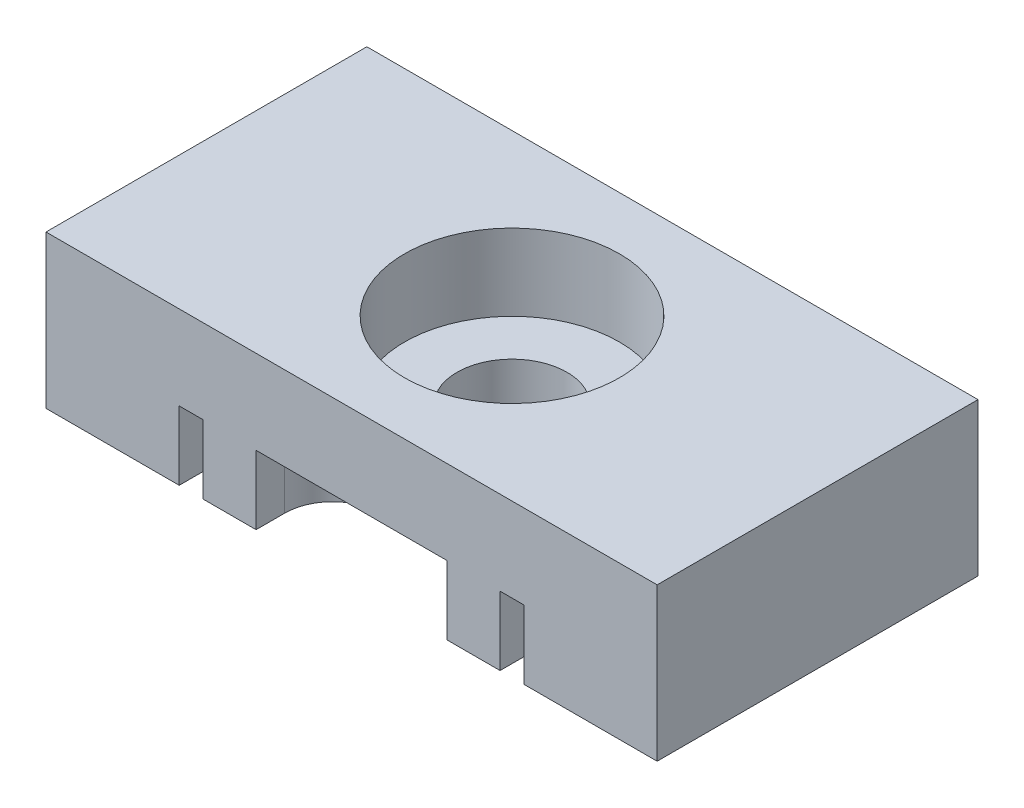
ISO-10303-21;
HEADER;
FILE_DESCRIPTION(('STEP AP214'),'2;1');
FILE_NAME('part.step','',(''),(''),'','','');
FILE_SCHEMA(('AUTOMOTIVE_DESIGN { 1 0 10303 214 1 1 1 1 }'));
ENDSEC;
DATA;
#1=APPLICATION_CONTEXT('core data for automotive mechanical design processes');
#2=APPLICATION_PROTOCOL_DEFINITION('international standard','automotive_design',2000,#1);
#3=PRODUCT_CONTEXT('',#1,'mechanical');
#4=PRODUCT('Part','Part','',(#3));
#5=PRODUCT_RELATED_PRODUCT_CATEGORY('part','',(#4));
#6=PRODUCT_DEFINITION_FORMATION('','',#4);
#7=PRODUCT_DEFINITION_CONTEXT('part definition',#1,'design');
#8=PRODUCT_DEFINITION('design','',#6,#7);
#9=PRODUCT_DEFINITION_SHAPE('','',#8);
#10=(LENGTH_UNIT() NAMED_UNIT(*) SI_UNIT(.MILLI.,.METRE.));
#11=(NAMED_UNIT(*) PLANE_ANGLE_UNIT() SI_UNIT($,.RADIAN.));
#12=(NAMED_UNIT(*) SI_UNIT($,.STERADIAN.) SOLID_ANGLE_UNIT());
#13=UNCERTAINTY_MEASURE_WITH_UNIT(LENGTH_MEASURE(1.E-05),#10,'distance_accuracy_value','');
#14=(GEOMETRIC_REPRESENTATION_CONTEXT(3) GLOBAL_UNCERTAINTY_ASSIGNED_CONTEXT((#13)) GLOBAL_UNIT_ASSIGNED_CONTEXT((#10,
#11,#12)) REPRESENTATION_CONTEXT('',''));
#15=CARTESIAN_POINT('',(0.,0.,0.));
#16=DIRECTION('',(0.,0.,1.));
#17=DIRECTION('',(1.,0.,0.));
#18=AXIS2_PLACEMENT_3D('',#15,#16,#17);
#19=CARTESIAN_POINT('',(10.16,5.08,5.334));
#20=DIRECTION('',(-1.,0.,0.));
#21=DIRECTION('',(0.,0.,1.));
#22=AXIS2_PLACEMENT_3D('',#19,#20,#21);
#23=PLANE('',#22);
#24=DIRECTION('',(0.,0.,-1.));
#25=VECTOR('',#24,1.);
#26=CARTESIAN_POINT('',(10.16,0.,5.334));
#27=LINE('',#26,#25);
#28=CARTESIAN_POINT('',(10.16,0.,5.334));
#29=VERTEX_POINT('',#28);
#30=CARTESIAN_POINT('',(10.16,0.,-5.334));
#31=VERTEX_POINT('',#30);
#32=EDGE_CURVE('E266',#29,#31,#27,.T.);
#33=ORIENTED_EDGE('',*,*,#32,.T.);
#34=DIRECTION('',(0.,-1.,0.));
#35=VECTOR('',#34,1.);
#36=CARTESIAN_POINT('',(10.16,5.08,-5.334));
#37=LINE('',#36,#35);
#38=CARTESIAN_POINT('',(10.16,5.08,-5.334));
#39=VERTEX_POINT('',#38);
#40=EDGE_CURVE('E301',#39,#31,#37,.T.);
#41=ORIENTED_EDGE('',*,*,#40,.F.);
#42=DIRECTION('',(0.,0.,-1.));
#43=VECTOR('',#42,1.);
#44=CARTESIAN_POINT('',(10.16,5.08,5.334));
#45=LINE('',#44,#43);
#46=CARTESIAN_POINT('',(10.16,5.08,5.334));
#47=VERTEX_POINT('',#46);
#48=EDGE_CURVE('E272',#47,#39,#45,.T.);
#49=ORIENTED_EDGE('',*,*,#48,.F.);
#50=DIRECTION('',(0.,-1.,0.));
#51=VECTOR('',#50,1.);
#52=CARTESIAN_POINT('',(10.16,5.08,5.334));
#53=LINE('',#52,#51);
#54=EDGE_CURVE('E282',#47,#29,#53,.T.);
#55=ORIENTED_EDGE('',*,*,#54,.T.);
#56=EDGE_LOOP('',(#33,#41,#49,#55));
#57=FACE_BOUND('',#56,.T.);
#58=ADVANCED_FACE('F32',(#57),#23,.F.);
#59=CARTESIAN_POINT('',(-10.16,5.08,-5.334));
#60=DIRECTION('',(0.,0.,1.));
#61=DIRECTION('',(1.,0.,0.));
#62=AXIS2_PLACEMENT_3D('',#59,#60,#61);
#63=PLANE('',#62);
#64=DIRECTION('',(-1.,0.,0.));
#65=VECTOR('',#64,1.);
#66=CARTESIAN_POINT('',(-10.16,0.,-5.334));
#67=LINE('',#66,#65);
#68=CARTESIAN_POINT('',(-10.16,0.,-5.334));
#69=VERTEX_POINT('',#68);
#70=EDGE_CURVE('E285',#31,#69,#67,.T.);
#71=ORIENTED_EDGE('',*,*,#70,.T.);
#72=DIRECTION('',(0.,-1.,0.));
#73=VECTOR('',#72,1.);
#74=CARTESIAN_POINT('',(-10.16,5.08,-5.334));
#75=LINE('',#74,#73);
#76=CARTESIAN_POINT('',(-10.16,5.08,-5.334));
#77=VERTEX_POINT('',#76);
#78=EDGE_CURVE('E298',#77,#69,#75,.T.);
#79=ORIENTED_EDGE('',*,*,#78,.F.);
#80=DIRECTION('',(-1.,0.,0.));
#81=VECTOR('',#80,1.);
#82=CARTESIAN_POINT('',(-10.16,5.08,-5.334));
#83=LINE('',#82,#81);
#84=EDGE_CURVE('E275',#39,#77,#83,.T.);
#85=ORIENTED_EDGE('',*,*,#84,.F.);
#86=ORIENTED_EDGE('',*,*,#40,.T.);
#87=EDGE_LOOP('',(#71,#79,#85,#86));
#88=FACE_BOUND('',#87,.T.);
#89=ADVANCED_FACE('F339',(#88),#63,.F.);
#90=CARTESIAN_POINT('',(-10.16,5.08,5.334));
#91=DIRECTION('',(1.,0.,0.));
#92=DIRECTION('',(0.,0.,-1.));
#93=AXIS2_PLACEMENT_3D('',#90,#91,#92);
#94=PLANE('',#93);
#95=DIRECTION('',(0.,0.,1.));
#96=VECTOR('',#95,1.);
#97=CARTESIAN_POINT('',(-10.16,0.,5.334));
#98=LINE('',#97,#96);
#99=CARTESIAN_POINT('',(-10.16,0.,5.334));
#100=VERTEX_POINT('',#99);
#101=EDGE_CURVE('E287',#69,#100,#98,.T.);
#102=ORIENTED_EDGE('',*,*,#101,.T.);
#103=DIRECTION('',(0.,-1.,0.));
#104=VECTOR('',#103,1.);
#105=CARTESIAN_POINT('',(-10.16,5.08,5.334));
#106=LINE('',#105,#104);
#107=CARTESIAN_POINT('',(-10.16,5.08,5.334));
#108=VERTEX_POINT('',#107);
#109=EDGE_CURVE('E295',#108,#100,#106,.T.);
#110=ORIENTED_EDGE('',*,*,#109,.F.);
#111=DIRECTION('',(0.,0.,1.));
#112=VECTOR('',#111,1.);
#113=CARTESIAN_POINT('',(-10.16,5.08,5.334));
#114=LINE('',#113,#112);
#115=EDGE_CURVE('E278',#77,#108,#114,.T.);
#116=ORIENTED_EDGE('',*,*,#115,.F.);
#117=ORIENTED_EDGE('',*,*,#78,.T.);
#118=EDGE_LOOP('',(#102,#110,#116,#117));
#119=FACE_BOUND('',#118,.T.);
#120=ADVANCED_FACE('F344',(#119),#94,.F.);
#121=CARTESIAN_POINT('',(-10.16,5.08,5.334));
#122=DIRECTION('',(0.,0.,-1.));
#123=DIRECTION('',(-1.,0.,0.));
#124=AXIS2_PLACEMENT_3D('',#121,#122,#123);
#125=PLANE('',#124);
#126=DIRECTION('',(1.,0.,0.));
#127=VECTOR('',#126,1.);
#128=CARTESIAN_POINT('',(-10.16,0.,5.334));
#129=LINE('',#128,#127);
#130=CARTESIAN_POINT('',(-4.937125,0.,5.334));
#131=VERTEX_POINT('',#130);
#132=CARTESIAN_POINT('',(-3.175,0.,5.334));
#133=VERTEX_POINT('',#132);
#134=EDGE_CURVE('E292',#131,#133,#129,.T.);
#135=ORIENTED_EDGE('',*,*,#134,.T.);
#136=DIRECTION('',(0.,-1.,0.));
#137=VECTOR('',#136,1.);
#138=CARTESIAN_POINT('',(-3.175,2.286,5.334));
#139=LINE('',#138,#137);
#140=CARTESIAN_POINT('',(-3.175,2.286,5.334));
#141=VERTEX_POINT('',#140);
#142=EDGE_CURVE('E198',#141,#133,#139,.T.);
#143=ORIENTED_EDGE('',*,*,#142,.F.);
#144=DIRECTION('',(-1.,0.,0.));
#145=VECTOR('',#144,1.);
#146=CARTESIAN_POINT('',(-3.175,2.286,5.334));
#147=LINE('',#146,#145);
#148=CARTESIAN_POINT('',(3.175,2.286,5.334));
#149=VERTEX_POINT('',#148);
#150=EDGE_CURVE('E164',#149,#141,#147,.T.);
#151=ORIENTED_EDGE('',*,*,#150,.F.);
#152=DIRECTION('',(0.,-1.,0.));
#153=VECTOR('',#152,1.);
#154=CARTESIAN_POINT('',(3.175,2.286,5.334));
#155=LINE('',#154,#153);
#156=CARTESIAN_POINT('',(3.175,0.,5.334));
#157=VERTEX_POINT('',#156);
#158=EDGE_CURVE('E201',#149,#157,#155,.T.);
#159=ORIENTED_EDGE('',*,*,#158,.T.);
#160=CARTESIAN_POINT('',(4.937125,0.,5.334));
#161=VERTEX_POINT('',#160);
#162=EDGE_CURVE('E54',#157,#161,#129,.T.);
#163=ORIENTED_EDGE('',*,*,#162,.T.);
#164=DIRECTION('',(0.,-1.,0.));
#165=VECTOR('',#164,1.);
#166=CARTESIAN_POINT('',(4.937125,2.286,5.334));
#167=LINE('',#166,#165);
#168=CARTESIAN_POINT('',(4.937125,2.286,5.334));
#169=VERTEX_POINT('',#168);
#170=EDGE_CURVE('E230',#169,#161,#167,.T.);
#171=ORIENTED_EDGE('',*,*,#170,.F.);
#172=DIRECTION('',(-1.,0.,0.));
#173=VECTOR('',#172,1.);
#174=CARTESIAN_POINT('',(-10.16,2.286,5.334));
#175=LINE('',#174,#173);
#176=CARTESIAN_POINT('',(5.730875,2.286,5.334));
#177=VERTEX_POINT('',#176);
#178=EDGE_CURVE('E11',#177,#169,#175,.T.);
#179=ORIENTED_EDGE('',*,*,#178,.F.);
#180=DIRECTION('',(0.,-1.,0.));
#181=VECTOR('',#180,1.);
#182=CARTESIAN_POINT('',(5.730875,2.286,5.334));
#183=LINE('',#182,#181);
#184=CARTESIAN_POINT('',(5.730875,0.,5.334));
#185=VERTEX_POINT('',#184);
#186=EDGE_CURVE('E237',#177,#185,#183,.T.);
#187=ORIENTED_EDGE('',*,*,#186,.T.);
#188=EDGE_CURVE('E289',#185,#29,#129,.T.);
#189=ORIENTED_EDGE('',*,*,#188,.T.);
#190=ORIENTED_EDGE('',*,*,#54,.F.);
#191=DIRECTION('',(1.,0.,0.));
#192=VECTOR('',#191,1.);
#193=CARTESIAN_POINT('',(-10.16,5.08,5.334));
#194=LINE('',#193,#192);
#195=EDGE_CURVE('E280',#108,#47,#194,.T.);
#196=ORIENTED_EDGE('',*,*,#195,.F.);
#197=ORIENTED_EDGE('',*,*,#109,.T.);
#198=CARTESIAN_POINT('',(-5.730875,0.,5.334));
#199=VERTEX_POINT('',#198);
#200=EDGE_CURVE('E276',#100,#199,#129,.T.);
#201=ORIENTED_EDGE('',*,*,#200,.T.);
#202=DIRECTION('',(0.,-1.,0.));
#203=VECTOR('',#202,1.);
#204=CARTESIAN_POINT('',(-5.730875,2.286,5.334));
#205=LINE('',#204,#203);
#206=CARTESIAN_POINT('',(-5.730875,2.286,5.334));
#207=VERTEX_POINT('',#206);
#208=EDGE_CURVE('E256',#207,#199,#205,.T.);
#209=ORIENTED_EDGE('',*,*,#208,.F.);
#210=DIRECTION('',(-1.,0.,0.));
#211=VECTOR('',#210,1.);
#212=CARTESIAN_POINT('',(-10.16,2.286,5.334));
#213=LINE('',#212,#211);
#214=CARTESIAN_POINT('',(-4.937125,2.286,5.334));
#215=VERTEX_POINT('',#214);
#216=EDGE_CURVE('E39',#215,#207,#213,.T.);
#217=ORIENTED_EDGE('',*,*,#216,.F.);
#218=DIRECTION('',(0.,-1.,0.));
#219=VECTOR('',#218,1.);
#220=CARTESIAN_POINT('',(-4.937125,2.286,5.334));
#221=LINE('',#220,#219);
#222=EDGE_CURVE('E263',#215,#131,#221,.T.);
#223=ORIENTED_EDGE('',*,*,#222,.T.);
#224=EDGE_LOOP('',(#135,#143,#151,#159,#163,#171,#179,#187,#189,#190,#196,#197,#201,#209,#217,#223));
#225=FACE_BOUND('',#224,.T.);
#226=ADVANCED_FACE('F314',(#225),#125,.F.);
#227=CARTESIAN_POINT('',(0.,5.08,0.));
#228=DIRECTION('',(0.,-1.,0.));
#229=DIRECTION('',(0.,0.,-1.));
#230=AXIS2_PLACEMENT_3D('',#227,#228,#229);
#231=PLANE('',#230);
#232=CARTESIAN_POINT('',(0.,5.08,0.));
#233=DIRECTION('',(0.,1.,0.));
#234=DIRECTION('',(0.,0.,1.));
#235=AXIS2_PLACEMENT_3D('',#232,#233,#234);
#236=CIRCLE('',#235,3.57250999999999);
#237=CARTESIAN_POINT('',(0.,5.08,3.57250999999999));
#238=VERTEX_POINT('',#237);
#239=EDGE_CURVE('E200',#238,#238,#236,.T.);
#240=ORIENTED_EDGE('',*,*,#239,.F.);
#241=EDGE_LOOP('',(#240));
#242=FACE_BOUND('',#241,.T.);
#243=ORIENTED_EDGE('',*,*,#48,.T.);
#244=ORIENTED_EDGE('',*,*,#84,.T.);
#245=ORIENTED_EDGE('',*,*,#115,.T.);
#246=ORIENTED_EDGE('',*,*,#195,.T.);
#247=EDGE_LOOP('',(#243,#244,#245,#246));
#248=FACE_BOUND('',#247,.T.);
#249=ADVANCED_FACE('F342',(#242,#248),#231,.F.);
#250=CARTESIAN_POINT('',(0.,0.,0.));
#251=DIRECTION('',(0.,-1.,0.));
#252=DIRECTION('',(0.,0.,-1.));
#253=AXIS2_PLACEMENT_3D('',#250,#251,#252);
#254=PLANE('',#253);
#255=DIRECTION('',(0.,0.,-1.));
#256=VECTOR('',#255,1.);
#257=CARTESIAN_POINT('',(-3.175,0.,5.334));
#258=LINE('',#257,#256);
#259=CARTESIAN_POINT('',(-3.175,0.,4.38150000000001));
#260=VERTEX_POINT('',#259);
#261=EDGE_CURVE('E46',#133,#260,#258,.T.);
#262=ORIENTED_EDGE('',*,*,#261,.F.);
#263=ORIENTED_EDGE('',*,*,#134,.F.);
#264=DIRECTION('',(0.,0.,1.));
#265=VECTOR('',#264,1.);
#266=CARTESIAN_POINT('',(-4.937125,0.,5.334));
#267=LINE('',#266,#265);
#268=CARTESIAN_POINT('',(-4.937125,0.,3.8608));
#269=VERTEX_POINT('',#268);
#270=EDGE_CURVE('E250',#269,#131,#267,.T.);
#271=ORIENTED_EDGE('',*,*,#270,.F.);
#272=CARTESIAN_POINT('',(-5.334,0.,3.8608));
#273=DIRECTION('',(0.,-1.,0.));
#274=DIRECTION('',(0.,0.,-1.));
#275=AXIS2_PLACEMENT_3D('',#272,#273,#274);
#276=CIRCLE('',#275,0.396875);
#277=CARTESIAN_POINT('',(-5.730875,0.,3.8608));
#278=VERTEX_POINT('',#277);
#279=EDGE_CURVE('E259',#278,#269,#276,.T.);
#280=ORIENTED_EDGE('',*,*,#279,.F.);
#281=DIRECTION('',(0.,0.,-1.));
#282=VECTOR('',#281,1.);
#283=CARTESIAN_POINT('',(-5.730875,0.,5.334));
#284=LINE('',#283,#282);
#285=EDGE_CURVE('E240',#199,#278,#284,.T.);
#286=ORIENTED_EDGE('',*,*,#285,.F.);
#287=ORIENTED_EDGE('',*,*,#200,.F.);
#288=ORIENTED_EDGE('',*,*,#101,.F.);
#289=ORIENTED_EDGE('',*,*,#70,.F.);
#290=ORIENTED_EDGE('',*,*,#32,.F.);
#291=ORIENTED_EDGE('',*,*,#188,.F.);
#292=DIRECTION('',(0.,0.,1.));
#293=VECTOR('',#292,1.);
#294=CARTESIAN_POINT('',(5.730875,0.,5.334));
#295=LINE('',#294,#293);
#296=CARTESIAN_POINT('',(5.730875,0.,3.8608));
#297=VERTEX_POINT('',#296);
#298=EDGE_CURVE('E224',#297,#185,#295,.T.);
#299=ORIENTED_EDGE('',*,*,#298,.F.);
#300=CARTESIAN_POINT('',(5.334,0.,3.8608));
#301=DIRECTION('',(0.,-1.,0.));
#302=DIRECTION('',(0.,0.,-1.));
#303=AXIS2_PLACEMENT_3D('',#300,#301,#302);
#304=CIRCLE('',#303,0.396875);
#305=CARTESIAN_POINT('',(4.937125,0.,3.8608));
#306=VERTEX_POINT('',#305);
#307=EDGE_CURVE('E233',#306,#297,#304,.T.);
#308=ORIENTED_EDGE('',*,*,#307,.F.);
#309=DIRECTION('',(0.,0.,-1.));
#310=VECTOR('',#309,1.);
#311=CARTESIAN_POINT('',(4.937125,0.,5.334));
#312=LINE('',#311,#310);
#313=EDGE_CURVE('E219',#161,#306,#312,.T.);
#314=ORIENTED_EDGE('',*,*,#313,.F.);
#315=ORIENTED_EDGE('',*,*,#162,.F.);
#316=DIRECTION('',(0.,0.,1.));
#317=VECTOR('',#316,1.);
#318=CARTESIAN_POINT('',(3.175,0.,5.334));
#319=LINE('',#318,#317);
#320=CARTESIAN_POINT('',(3.175,0.,4.38150000000001));
#321=VERTEX_POINT('',#320);
#322=EDGE_CURVE('E178',#321,#157,#319,.T.);
#323=ORIENTED_EDGE('',*,*,#322,.F.);
#324=CARTESIAN_POINT('',(1.5875,0.,4.3815));
#325=DIRECTION('',(0.,-1.,0.));
#326=DIRECTION('',(0.,0.,-1.));
#327=AXIS2_PLACEMENT_3D('',#324,#325,#326);
#328=CIRCLE('',#327,1.5875);
#329=CARTESIAN_POINT('',(1.58749999999999,0.,2.794));
#330=VERTEX_POINT('',#329);
#331=EDGE_CURVE('E180',#330,#321,#328,.T.);
#332=ORIENTED_EDGE('',*,*,#331,.F.);
#333=DIRECTION('',(1.,0.,0.));
#334=VECTOR('',#333,1.);
#335=CARTESIAN_POINT('',(-1.58749999999999,0.,2.794));
#336=LINE('',#335,#334);
#337=CARTESIAN_POINT('',(-1.58749999999999,0.,2.794));
#338=VERTEX_POINT('',#337);
#339=EDGE_CURVE('E193',#338,#330,#336,.T.);
#340=ORIENTED_EDGE('',*,*,#339,.F.);
#341=CARTESIAN_POINT('',(-1.5875,0.,4.3815));
#342=DIRECTION('',(0.,-1.,0.));
#343=DIRECTION('',(0.,0.,1.));
#344=AXIS2_PLACEMENT_3D('',#341,#342,#343);
#345=CIRCLE('',#344,1.5875);
#346=EDGE_CURVE('E191',#260,#338,#345,.T.);
#347=ORIENTED_EDGE('',*,*,#346,.F.);
#348=EDGE_LOOP('',(#262,#263,#271,#280,#286,#287,#288,#289,#290,#291,#299,#308,#314,#315,#323,
#332,#340,#347));
#349=FACE_BOUND('',#348,.T.);
#350=CARTESIAN_POINT('',(0.,0.,0.));
#351=DIRECTION('',(0.,1.,0.));
#352=DIRECTION('',(0.,0.,1.));
#353=AXIS2_PLACEMENT_3D('',#350,#351,#352);
#354=CIRCLE('',#353,1.8288);
#355=CARTESIAN_POINT('',(0.,0.,1.8288));
#356=VERTEX_POINT('',#355);
#357=EDGE_CURVE('E216',#356,#356,#354,.T.);
#358=ORIENTED_EDGE('',*,*,#357,.T.);
#359=EDGE_LOOP('',(#358));
#360=FACE_BOUND('',#359,.T.);
#361=ADVANCED_FACE('F320',(#349,#360),#254,.T.);
#362=CARTESIAN_POINT('',(-5.334,2.286,5.334));
#363=DIRECTION('',(0.,-1.,0.));
#364=DIRECTION('',(0.,0.,-1.));
#365=AXIS2_PLACEMENT_3D('',#362,#363,#364);
#366=PLANE('',#365);
#367=ORIENTED_EDGE('',*,*,#216,.T.);
#368=DIRECTION('',(0.,0.,-1.));
#369=VECTOR('',#368,1.);
#370=CARTESIAN_POINT('',(-5.730875,2.286,5.334));
#371=LINE('',#370,#369);
#372=CARTESIAN_POINT('',(-5.730875,2.286,3.8608));
#373=VERTEX_POINT('',#372);
#374=EDGE_CURVE('E246',#207,#373,#371,.T.);
#375=ORIENTED_EDGE('',*,*,#374,.T.);
#376=CARTESIAN_POINT('',(-5.334,2.286,3.8608));
#377=DIRECTION('',(0.,-1.,0.));
#378=DIRECTION('',(0.,0.,-1.));
#379=AXIS2_PLACEMENT_3D('',#376,#377,#378);
#380=CIRCLE('',#379,0.396875);
#381=CARTESIAN_POINT('',(-4.937125,2.286,3.8608));
#382=VERTEX_POINT('',#381);
#383=EDGE_CURVE('E249',#373,#382,#380,.T.);
#384=ORIENTED_EDGE('',*,*,#383,.T.);
#385=DIRECTION('',(0.,0.,1.));
#386=VECTOR('',#385,1.);
#387=CARTESIAN_POINT('',(-4.937125,2.286,5.334));
#388=LINE('',#387,#386);
#389=EDGE_CURVE('E253',#382,#215,#388,.T.);
#390=ORIENTED_EDGE('',*,*,#389,.T.);
#391=EDGE_LOOP('',(#367,#375,#384,#390));
#392=FACE_BOUND('',#391,.T.);
#393=ADVANCED_FACE('F306',(#392),#366,.T.);
#394=CARTESIAN_POINT('',(-4.937125,2.286,5.334));
#395=DIRECTION('',(1.,0.,0.));
#396=DIRECTION('',(0.,0.,-1.));
#397=AXIS2_PLACEMENT_3D('',#394,#395,#396);
#398=PLANE('',#397);
#399=ORIENTED_EDGE('',*,*,#270,.T.);
#400=ORIENTED_EDGE('',*,*,#222,.F.);
#401=ORIENTED_EDGE('',*,*,#389,.F.);
#402=DIRECTION('',(0.,-1.,0.));
#403=VECTOR('',#402,1.);
#404=CARTESIAN_POINT('',(-4.937125,2.286,3.8608));
#405=LINE('',#404,#403);
#406=EDGE_CURVE('E267',#382,#269,#405,.T.);
#407=ORIENTED_EDGE('',*,*,#406,.T.);
#408=EDGE_LOOP('',(#399,#400,#401,#407));
#409=FACE_BOUND('',#408,.T.);
#410=ADVANCED_FACE('F328',(#409),#398,.F.);
#411=CARTESIAN_POINT('',(-5.334,2.286,3.8608));
#412=DIRECTION('',(0.,-1.,0.));
#413=DIRECTION('',(0.,0.,-1.));
#414=AXIS2_PLACEMENT_3D('',#411,#412,#413);
#415=CYLINDRICAL_SURFACE('',#414,0.396875);
#416=ORIENTED_EDGE('',*,*,#279,.T.);
#417=ORIENTED_EDGE('',*,*,#406,.F.);
#418=ORIENTED_EDGE('',*,*,#383,.F.);
#419=DIRECTION('',(0.,-1.,0.));
#420=VECTOR('',#419,1.);
#421=CARTESIAN_POINT('',(-5.730875,2.286,3.8608));
#422=LINE('',#421,#420);
#423=EDGE_CURVE('E269',#373,#278,#422,.T.);
#424=ORIENTED_EDGE('',*,*,#423,.T.);
#425=EDGE_LOOP('',(#416,#417,#418,#424));
#426=FACE_BOUND('',#425,.T.);
#427=ADVANCED_FACE('F326',(#426),#415,.F.);
#428=CARTESIAN_POINT('',(-5.730875,2.286,5.334));
#429=DIRECTION('',(-1.,0.,0.));
#430=DIRECTION('',(0.,0.,1.));
#431=AXIS2_PLACEMENT_3D('',#428,#429,#430);
#432=PLANE('',#431);
#433=ORIENTED_EDGE('',*,*,#285,.T.);
#434=ORIENTED_EDGE('',*,*,#423,.F.);
#435=ORIENTED_EDGE('',*,*,#374,.F.);
#436=ORIENTED_EDGE('',*,*,#208,.T.);
#437=EDGE_LOOP('',(#433,#434,#435,#436));
#438=FACE_BOUND('',#437,.T.);
#439=ADVANCED_FACE('F310',(#438),#432,.F.);
#440=CARTESIAN_POINT('',(5.334,2.286,5.334));
#441=DIRECTION('',(0.,-1.,0.));
#442=DIRECTION('',(0.,0.,-1.));
#443=AXIS2_PLACEMENT_3D('',#440,#441,#442);
#444=PLANE('',#443);
#445=ORIENTED_EDGE('',*,*,#178,.T.);
#446=DIRECTION('',(0.,0.,-1.));
#447=VECTOR('',#446,1.);
#448=CARTESIAN_POINT('',(4.937125,2.286,5.334));
#449=LINE('',#448,#447);
#450=CARTESIAN_POINT('',(4.937125,2.286,3.8608));
#451=VERTEX_POINT('',#450);
#452=EDGE_CURVE('E220',#169,#451,#449,.T.);
#453=ORIENTED_EDGE('',*,*,#452,.T.);
#454=CARTESIAN_POINT('',(5.334,2.286,3.8608));
#455=DIRECTION('',(0.,-1.,0.));
#456=DIRECTION('',(0.,0.,-1.));
#457=AXIS2_PLACEMENT_3D('',#454,#455,#456);
#458=CIRCLE('',#457,0.396875);
#459=CARTESIAN_POINT('',(5.730875,2.286,3.8608));
#460=VERTEX_POINT('',#459);
#461=EDGE_CURVE('E223',#451,#460,#458,.T.);
#462=ORIENTED_EDGE('',*,*,#461,.T.);
#463=DIRECTION('',(0.,0.,1.));
#464=VECTOR('',#463,1.);
#465=CARTESIAN_POINT('',(5.730875,2.286,5.334));
#466=LINE('',#465,#464);
#467=EDGE_CURVE('E227',#460,#177,#466,.T.);
#468=ORIENTED_EDGE('',*,*,#467,.T.);
#469=EDGE_LOOP('',(#445,#453,#462,#468));
#470=FACE_BOUND('',#469,.T.);
#471=ADVANCED_FACE('F399',(#470),#444,.T.);
#472=CARTESIAN_POINT('',(5.730875,2.286,5.334));
#473=DIRECTION('',(1.,0.,0.));
#474=DIRECTION('',(0.,0.,-1.));
#475=AXIS2_PLACEMENT_3D('',#472,#473,#474);
#476=PLANE('',#475);
#477=ORIENTED_EDGE('',*,*,#298,.T.);
#478=ORIENTED_EDGE('',*,*,#186,.F.);
#479=ORIENTED_EDGE('',*,*,#467,.F.);
#480=DIRECTION('',(0.,-1.,0.));
#481=VECTOR('',#480,1.);
#482=CARTESIAN_POINT('',(5.730875,2.286,3.8608));
#483=LINE('',#482,#481);
#484=EDGE_CURVE('E241',#460,#297,#483,.T.);
#485=ORIENTED_EDGE('',*,*,#484,.T.);
#486=EDGE_LOOP('',(#477,#478,#479,#485));
#487=FACE_BOUND('',#486,.T.);
#488=ADVANCED_FACE('F408',(#487),#476,.F.);
#489=CARTESIAN_POINT('',(5.334,2.286,3.8608));
#490=DIRECTION('',(0.,-1.,0.));
#491=DIRECTION('',(0.,0.,-1.));
#492=AXIS2_PLACEMENT_3D('',#489,#490,#491);
#493=CYLINDRICAL_SURFACE('',#492,0.396875);
#494=ORIENTED_EDGE('',*,*,#307,.T.);
#495=ORIENTED_EDGE('',*,*,#484,.F.);
#496=ORIENTED_EDGE('',*,*,#461,.F.);
#497=DIRECTION('',(0.,-1.,0.));
#498=VECTOR('',#497,1.);
#499=CARTESIAN_POINT('',(4.937125,2.286,3.8608));
#500=LINE('',#499,#498);
#501=EDGE_CURVE('E243',#451,#306,#500,.T.);
#502=ORIENTED_EDGE('',*,*,#501,.T.);
#503=EDGE_LOOP('',(#494,#495,#496,#502));
#504=FACE_BOUND('',#503,.T.);
#505=ADVANCED_FACE('F418',(#504),#493,.F.);
#506=CARTESIAN_POINT('',(4.937125,2.286,5.334));
#507=DIRECTION('',(-1.,0.,0.));
#508=DIRECTION('',(0.,0.,1.));
#509=AXIS2_PLACEMENT_3D('',#506,#507,#508);
#510=PLANE('',#509);
#511=ORIENTED_EDGE('',*,*,#313,.T.);
#512=ORIENTED_EDGE('',*,*,#501,.F.);
#513=ORIENTED_EDGE('',*,*,#452,.F.);
#514=ORIENTED_EDGE('',*,*,#170,.T.);
#515=EDGE_LOOP('',(#511,#512,#513,#514));
#516=FACE_BOUND('',#515,.T.);
#517=ADVANCED_FACE('F428',(#516),#510,.F.);
#518=CARTESIAN_POINT('',(0.,5.08,0.));
#519=DIRECTION('',(0.,1.,0.));
#520=DIRECTION('',(0.,0.,1.));
#521=AXIS2_PLACEMENT_3D('',#518,#519,#520);
#522=CYLINDRICAL_SURFACE('',#521,1.8288);
#523=ORIENTED_EDGE('',*,*,#357,.F.);
#524=EDGE_LOOP('',(#523));
#525=FACE_BOUND('',#524,.T.);
#526=CARTESIAN_POINT('',(0.,2.54,0.));
#527=DIRECTION('',(0.,1.,0.));
#528=DIRECTION('',(0.,0.,1.));
#529=AXIS2_PLACEMENT_3D('',#526,#527,#528);
#530=CIRCLE('',#529,1.8288);
#531=CARTESIAN_POINT('',(0.,2.54,1.8288));
#532=VERTEX_POINT('',#531);
#533=EDGE_CURVE('E213',#532,#532,#530,.T.);
#534=ORIENTED_EDGE('',*,*,#533,.T.);
#535=EDGE_LOOP('',(#534));
#536=FACE_BOUND('',#535,.T.);
#537=ADVANCED_FACE('F438',(#525,#536),#522,.F.);
#538=CARTESIAN_POINT('',(1.8288,2.54,0.));
#539=DIRECTION('',(0.,-1.,0.));
#540=DIRECTION('',(0.,0.,-1.));
#541=AXIS2_PLACEMENT_3D('',#538,#539,#540);
#542=PLANE('',#541);
#543=ORIENTED_EDGE('',*,*,#533,.F.);
#544=EDGE_LOOP('',(#543));
#545=FACE_BOUND('',#544,.T.);
#546=CARTESIAN_POINT('',(0.,2.54,0.));
#547=DIRECTION('',(0.,1.,0.));
#548=DIRECTION('',(0.,0.,1.));
#549=AXIS2_PLACEMENT_3D('',#546,#547,#548);
#550=CIRCLE('',#549,3.57251);
#551=CARTESIAN_POINT('',(0.,2.54,3.57251));
#552=VERTEX_POINT('',#551);
#553=EDGE_CURVE('E210',#552,#552,#550,.T.);
#554=ORIENTED_EDGE('',*,*,#553,.T.);
#555=EDGE_LOOP('',(#554));
#556=FACE_BOUND('',#555,.T.);
#557=ADVANCED_FACE('F457',(#545,#556),#542,.F.);
#558=CARTESIAN_POINT('',(0.,5.08,0.));
#559=DIRECTION('',(0.,1.,0.));
#560=DIRECTION('',(0.,0.,1.));
#561=AXIS2_PLACEMENT_3D('',#558,#559,#560);
#562=CYLINDRICAL_SURFACE('',#561,3.57251);
#563=ORIENTED_EDGE('',*,*,#553,.F.);
#564=EDGE_LOOP('',(#563));
#565=FACE_BOUND('',#564,.T.);
#566=ORIENTED_EDGE('',*,*,#239,.T.);
#567=EDGE_LOOP('',(#566));
#568=FACE_BOUND('',#567,.T.);
#569=ADVANCED_FACE('F467',(#565,#568),#562,.F.);
#570=CARTESIAN_POINT('',(-3.175,2.286,5.334));
#571=DIRECTION('',(-1.,0.,0.));
#572=DIRECTION('',(0.,0.,1.));
#573=AXIS2_PLACEMENT_3D('',#570,#571,#572);
#574=PLANE('',#573);
#575=ORIENTED_EDGE('',*,*,#261,.T.);
#576=DIRECTION('',(0.,-1.,0.));
#577=VECTOR('',#576,1.);
#578=CARTESIAN_POINT('',(-3.175,2.286,4.38150000000001));
#579=LINE('',#578,#577);
#580=CARTESIAN_POINT('',(-3.175,2.286,4.38150000000001));
#581=VERTEX_POINT('',#580);
#582=EDGE_CURVE('E154',#581,#260,#579,.T.);
#583=ORIENTED_EDGE('',*,*,#582,.F.);
#584=DIRECTION('',(0.,0.,-1.));
#585=VECTOR('',#584,1.);
#586=CARTESIAN_POINT('',(-3.175,2.286,5.334));
#587=LINE('',#586,#585);
#588=EDGE_CURVE('E158',#141,#581,#587,.T.);
#589=ORIENTED_EDGE('',*,*,#588,.F.);
#590=ORIENTED_EDGE('',*,*,#142,.T.);
#591=EDGE_LOOP('',(#575,#583,#589,#590));
#592=FACE_BOUND('',#591,.T.);
#593=ADVANCED_FACE('F156',(#592),#574,.F.);
#594=CARTESIAN_POINT('',(3.175,2.286,5.334));
#595=DIRECTION('',(1.,0.,0.));
#596=DIRECTION('',(0.,0.,-1.));
#597=AXIS2_PLACEMENT_3D('',#594,#595,#596);
#598=PLANE('',#597);
#599=ORIENTED_EDGE('',*,*,#322,.T.);
#600=ORIENTED_EDGE('',*,*,#158,.F.);
#601=DIRECTION('',(0.,0.,1.));
#602=VECTOR('',#601,1.);
#603=CARTESIAN_POINT('',(3.175,2.286,5.334));
#604=LINE('',#603,#602);
#605=CARTESIAN_POINT('',(3.175,2.286,4.38150000000001));
#606=VERTEX_POINT('',#605);
#607=EDGE_CURVE('E187',#606,#149,#604,.T.);
#608=ORIENTED_EDGE('',*,*,#607,.F.);
#609=DIRECTION('',(0.,-1.,0.));
#610=VECTOR('',#609,1.);
#611=CARTESIAN_POINT('',(3.175,2.286,4.38150000000001));
#612=LINE('',#611,#610);
#613=EDGE_CURVE('E203',#606,#321,#612,.T.);
#614=ORIENTED_EDGE('',*,*,#613,.T.);
#615=EDGE_LOOP('',(#599,#600,#608,#614));
#616=FACE_BOUND('',#615,.T.);
#617=ADVANCED_FACE('F497',(#616),#598,.F.);
#618=CARTESIAN_POINT('',(1.5875,2.286,4.3815));
#619=DIRECTION('',(0.,-1.,0.));
#620=DIRECTION('',(0.,0.,-1.));
#621=AXIS2_PLACEMENT_3D('',#618,#619,#620);
#622=CYLINDRICAL_SURFACE('',#621,1.5875);
#623=ORIENTED_EDGE('',*,*,#331,.T.);
#624=ORIENTED_EDGE('',*,*,#613,.F.);
#625=CARTESIAN_POINT('',(1.5875,2.286,4.3815));
#626=DIRECTION('',(0.,-1.,0.));
#627=DIRECTION('',(0.,0.,-1.));
#628=AXIS2_PLACEMENT_3D('',#625,#626,#627);
#629=CIRCLE('',#628,1.5875);
#630=CARTESIAN_POINT('',(1.58749999999999,2.286,2.794));
#631=VERTEX_POINT('',#630);
#632=EDGE_CURVE('E184',#631,#606,#629,.T.);
#633=ORIENTED_EDGE('',*,*,#632,.F.);
#634=DIRECTION('',(0.,-1.,0.));
#635=VECTOR('',#634,1.);
#636=CARTESIAN_POINT('',(1.58749999999999,2.286,2.794));
#637=LINE('',#636,#635);
#638=EDGE_CURVE('E205',#631,#330,#637,.T.);
#639=ORIENTED_EDGE('',*,*,#638,.T.);
#640=EDGE_LOOP('',(#623,#624,#633,#639));
#641=FACE_BOUND('',#640,.T.);
#642=ADVANCED_FACE('F506',(#641),#622,.F.);
#643=CARTESIAN_POINT('',(-1.58749999999999,2.286,2.794));
#644=DIRECTION('',(0.,0.,-1.));
#645=DIRECTION('',(-1.,0.,0.));
#646=AXIS2_PLACEMENT_3D('',#643,#644,#645);
#647=PLANE('',#646);
#648=ORIENTED_EDGE('',*,*,#339,.T.);
#649=ORIENTED_EDGE('',*,*,#638,.F.);
#650=DIRECTION('',(1.,0.,0.));
#651=VECTOR('',#650,1.);
#652=CARTESIAN_POINT('',(-1.58749999999999,2.286,2.794));
#653=LINE('',#652,#651);
#654=CARTESIAN_POINT('',(-1.58749999999999,2.286,2.794));
#655=VERTEX_POINT('',#654);
#656=EDGE_CURVE('E172',#655,#631,#653,.T.);
#657=ORIENTED_EDGE('',*,*,#656,.F.);
#658=DIRECTION('',(0.,-1.,0.));
#659=VECTOR('',#658,1.);
#660=CARTESIAN_POINT('',(-1.58749999999999,2.286,2.794));
#661=LINE('',#660,#659);
#662=EDGE_CURVE('E163',#655,#338,#661,.T.);
#663=ORIENTED_EDGE('',*,*,#662,.T.);
#664=EDGE_LOOP('',(#648,#649,#657,#663));
#665=FACE_BOUND('',#664,.T.);
#666=ADVANCED_FACE('F516',(#665),#647,.F.);
#667=CARTESIAN_POINT('',(-1.5875,2.286,4.3815));
#668=DIRECTION('',(0.,-1.,0.));
#669=DIRECTION('',(0.,0.,-1.));
#670=AXIS2_PLACEMENT_3D('',#667,#668,#669);
#671=CYLINDRICAL_SURFACE('',#670,1.5875);
#672=ORIENTED_EDGE('',*,*,#346,.T.);
#673=ORIENTED_EDGE('',*,*,#662,.F.);
#674=CARTESIAN_POINT('',(-1.5875,2.286,4.3815));
#675=DIRECTION('',(0.,-1.,0.));
#676=DIRECTION('',(0.,0.,1.));
#677=AXIS2_PLACEMENT_3D('',#674,#675,#676);
#678=CIRCLE('',#677,1.5875);
#679=EDGE_CURVE('E167',#581,#655,#678,.T.);
#680=ORIENTED_EDGE('',*,*,#679,.F.);
#681=ORIENTED_EDGE('',*,*,#582,.T.);
#682=EDGE_LOOP('',(#672,#673,#680,#681));
#683=FACE_BOUND('',#682,.T.);
#684=ADVANCED_FACE('F168',(#683),#671,.F.);
#685=CARTESIAN_POINT('',(-1.5875,2.286,4.3815));
#686=DIRECTION('',(0.,1.,0.));
#687=DIRECTION('',(0.,0.,1.));
#688=AXIS2_PLACEMENT_3D('',#685,#686,#687);
#689=PLANE('',#688);
#690=ORIENTED_EDGE('',*,*,#588,.T.);
#691=ORIENTED_EDGE('',*,*,#679,.T.);
#692=ORIENTED_EDGE('',*,*,#656,.T.);
#693=ORIENTED_EDGE('',*,*,#632,.T.);
#694=ORIENTED_EDGE('',*,*,#607,.T.);
#695=ORIENTED_EDGE('',*,*,#150,.T.);
#696=EDGE_LOOP('',(#690,#691,#692,#693,#694,#695));
#697=FACE_BOUND('',#696,.T.);
#698=ADVANCED_FACE('F174',(#697),#689,.F.);
#699=CLOSED_SHELL('',(#58,#89,#120,#226,#249,#361,#393,#410,#427,#439,#471,#488,#505,#517,#537,
#557,#569,#593,#617,#642,#666,#684,#698));
#700=MANIFOLD_SOLID_BREP('B2',#699);
#701=ADVANCED_BREP_SHAPE_REPRESENTATION('',(#18,#700),#14);
#702=SHAPE_DEFINITION_REPRESENTATION(#9,#701);
ENDSEC;
END-ISO-10303-21;
